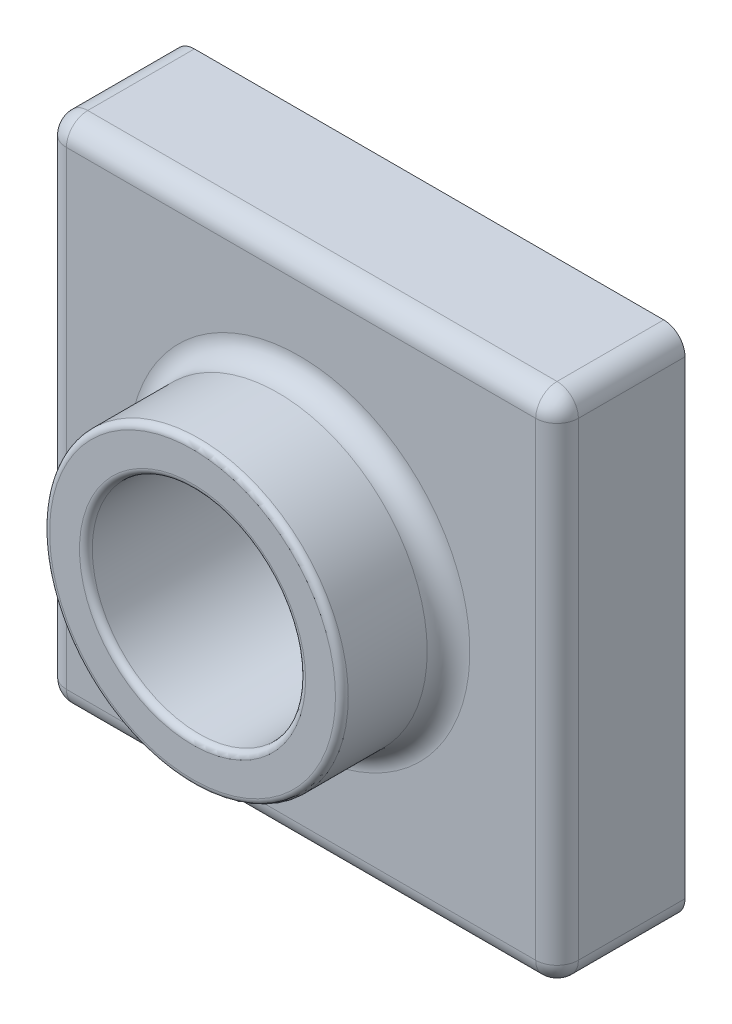
ISO-10303-21;
HEADER;
FILE_DESCRIPTION(('STEP AP214'),'2;1');
FILE_NAME('part.step','',(''),(''),'','','');
FILE_SCHEMA(('AUTOMOTIVE_DESIGN { 1 0 10303 214 1 1 1 1 }'));
ENDSEC;
DATA;
#1=APPLICATION_CONTEXT('core data for automotive mechanical design processes');
#2=APPLICATION_PROTOCOL_DEFINITION('international standard','automotive_design',2000,#1);
#3=PRODUCT_CONTEXT('',#1,'mechanical');
#4=PRODUCT('Part','Part','',(#3));
#5=PRODUCT_RELATED_PRODUCT_CATEGORY('part','',(#4));
#6=PRODUCT_DEFINITION_FORMATION('','',#4);
#7=PRODUCT_DEFINITION_CONTEXT('part definition',#1,'design');
#8=PRODUCT_DEFINITION('design','',#6,#7);
#9=PRODUCT_DEFINITION_SHAPE('','',#8);
#10=(LENGTH_UNIT() NAMED_UNIT(*) SI_UNIT(.MILLI.,.METRE.));
#11=(NAMED_UNIT(*) PLANE_ANGLE_UNIT() SI_UNIT($,.RADIAN.));
#12=(NAMED_UNIT(*) SI_UNIT($,.STERADIAN.) SOLID_ANGLE_UNIT());
#13=UNCERTAINTY_MEASURE_WITH_UNIT(LENGTH_MEASURE(1.E-05),#10,'distance_accuracy_value','');
#14=(GEOMETRIC_REPRESENTATION_CONTEXT(3) GLOBAL_UNCERTAINTY_ASSIGNED_CONTEXT((#13)) GLOBAL_UNIT_ASSIGNED_CONTEXT((#10,
#11,#12)) REPRESENTATION_CONTEXT('',''));
#15=CARTESIAN_POINT('',(0.,0.,0.));
#16=DIRECTION('',(0.,0.,1.));
#17=DIRECTION('',(1.,0.,0.));
#18=AXIS2_PLACEMENT_3D('',#15,#16,#17);
#19=CARTESIAN_POINT('',(0.,0.,0.));
#20=DIRECTION('',(0.,0.,-1.));
#21=DIRECTION('',(-1.,0.,0.));
#22=AXIS2_PLACEMENT_3D('',#19,#20,#21);
#23=PLANE('',#22);
#24=CARTESIAN_POINT('',(59.5646394836595,60.,0.));
#25=DIRECTION('',(0.,0.,-1.));
#26=DIRECTION('',(-1.,0.,0.));
#27=AXIS2_PLACEMENT_3D('',#24,#25,#26);
#28=CIRCLE('',#27,25.);
#29=CARTESIAN_POINT('',(34.5646394836595,60.,0.));
#30=VERTEX_POINT('',#29);
#31=EDGE_CURVE('E297',#30,#30,#28,.T.);
#32=ORIENTED_EDGE('',*,*,#31,.F.);
#33=EDGE_LOOP('',(#32));
#34=FACE_BOUND('',#33,.T.);
#35=CARTESIAN_POINT('',(59.5646394836595,60.,0.));
#36=DIRECTION('',(0.,0.,-1.));
#37=DIRECTION('',(-1.,0.,0.));
#38=AXIS2_PLACEMENT_3D('',#35,#36,#37);
#39=CIRCLE('',#38,27.);
#40=CARTESIAN_POINT('',(32.5646394836595,60.,0.));
#41=VERTEX_POINT('',#40);
#42=EDGE_CURVE('E228',#41,#41,#39,.T.);
#43=ORIENTED_EDGE('',*,*,#42,.T.);
#44=EDGE_LOOP('',(#43));
#45=FACE_BOUND('',#44,.T.);
#46=ADVANCED_FACE('F38',(#34,#45),#23,.T.);
#47=DIRECTION('',(1.,0.,0.));
#48=VECTOR('',#47,1.);
#49=CARTESIAN_POINT('',(0.,0.,0.));
#50=LINE('',#49,#48);
#51=CARTESIAN_POINT('',(5.,0.,0.));
#52=VERTEX_POINT('',#51);
#53=CARTESIAN_POINT('',(115.,0.,0.));
#54=VERTEX_POINT('',#53);
#55=EDGE_CURVE('E303',#52,#54,#50,.T.);
#56=ORIENTED_EDGE('',*,*,#55,.F.);
#57=CARTESIAN_POINT('',(5.,5.,0.));
#58=DIRECTION('',(0.,0.,-1.));
#59=DIRECTION('',(-1.,0.,0.));
#60=AXIS2_PLACEMENT_3D('',#57,#58,#59);
#61=CIRCLE('',#60,5.);
#62=CARTESIAN_POINT('',(0.,5.,0.));
#63=VERTEX_POINT('',#62);
#64=EDGE_CURVE('E357',#52,#63,#61,.T.);
#65=ORIENTED_EDGE('',*,*,#64,.T.);
#66=DIRECTION('',(0.,-1.,0.));
#67=VECTOR('',#66,1.);
#68=CARTESIAN_POINT('',(0.,0.,0.));
#69=LINE('',#68,#67);
#70=CARTESIAN_POINT('',(0.,115.,0.));
#71=VERTEX_POINT('',#70);
#72=EDGE_CURVE('E300',#71,#63,#69,.T.);
#73=ORIENTED_EDGE('',*,*,#72,.F.);
#74=CARTESIAN_POINT('',(4.99999999999996,115.,0.));
#75=DIRECTION('',(0.,0.,-1.));
#76=DIRECTION('',(-1.,0.,0.));
#77=AXIS2_PLACEMENT_3D('',#74,#75,#76);
#78=CIRCLE('',#77,5.);
#79=CARTESIAN_POINT('',(4.99999999999996,120.,0.));
#80=VERTEX_POINT('',#79);
#81=EDGE_CURVE('E353',#71,#80,#78,.T.);
#82=ORIENTED_EDGE('',*,*,#81,.T.);
#83=DIRECTION('',(-1.,0.,0.));
#84=VECTOR('',#83,1.);
#85=CARTESIAN_POINT('',(0.,120.,0.));
#86=LINE('',#85,#84);
#87=CARTESIAN_POINT('',(115.,120.,0.));
#88=VERTEX_POINT('',#87);
#89=EDGE_CURVE('E309',#88,#80,#86,.T.);
#90=ORIENTED_EDGE('',*,*,#89,.F.);
#91=CARTESIAN_POINT('',(115.,115.,0.));
#92=DIRECTION('',(0.,0.,-1.));
#93=DIRECTION('',(-1.,0.,0.));
#94=AXIS2_PLACEMENT_3D('',#91,#92,#93);
#95=CIRCLE('',#94,5.);
#96=CARTESIAN_POINT('',(120.,115.,0.));
#97=VERTEX_POINT('',#96);
#98=EDGE_CURVE('E351',#88,#97,#95,.T.);
#99=ORIENTED_EDGE('',*,*,#98,.T.);
#100=DIRECTION('',(0.,1.,0.));
#101=VECTOR('',#100,1.);
#102=CARTESIAN_POINT('',(120.,0.,0.));
#103=LINE('',#102,#101);
#104=CARTESIAN_POINT('',(120.,5.,0.));
#105=VERTEX_POINT('',#104);
#106=EDGE_CURVE('E306',#105,#97,#103,.T.);
#107=ORIENTED_EDGE('',*,*,#106,.F.);
#108=CARTESIAN_POINT('',(115.,5.,0.));
#109=DIRECTION('',(0.,0.,-1.));
#110=DIRECTION('',(-1.,0.,0.));
#111=AXIS2_PLACEMENT_3D('',#108,#109,#110);
#112=CIRCLE('',#111,5.);
#113=EDGE_CURVE('E355',#105,#54,#112,.T.);
#114=ORIENTED_EDGE('',*,*,#113,.T.);
#115=EDGE_LOOP('',(#56,#65,#73,#82,#90,#99,#107,#114));
#116=FACE_BOUND('',#115,.T.);
#117=CARTESIAN_POINT('',(5.,5.,0.));
#118=DIRECTION('',(0.,0.,-1.));
#119=DIRECTION('',(-1.,0.,0.));
#120=AXIS2_PLACEMENT_3D('',#117,#118,#119);
#121=CIRCLE('',#120,3.);
#122=CARTESIAN_POINT('',(5.,2.,0.));
#123=VERTEX_POINT('',#122);
#124=CARTESIAN_POINT('',(2.,5.,0.));
#125=VERTEX_POINT('',#124);
#126=EDGE_CURVE('E183',#123,#125,#121,.T.);
#127=ORIENTED_EDGE('',*,*,#126,.F.);
#128=DIRECTION('',(1.,0.,0.));
#129=VECTOR('',#128,1.);
#130=CARTESIAN_POINT('',(0.,2.,0.));
#131=LINE('',#130,#129);
#132=CARTESIAN_POINT('',(115.,2.,0.));
#133=VERTEX_POINT('',#132);
#134=EDGE_CURVE('E283',#123,#133,#131,.T.);
#135=ORIENTED_EDGE('',*,*,#134,.T.);
#136=CARTESIAN_POINT('',(115.,5.,0.));
#137=DIRECTION('',(0.,0.,-1.));
#138=DIRECTION('',(-1.,0.,0.));
#139=AXIS2_PLACEMENT_3D('',#136,#137,#138);
#140=CIRCLE('',#139,3.);
#141=CARTESIAN_POINT('',(118.,5.,0.));
#142=VERTEX_POINT('',#141);
#143=EDGE_CURVE('E286',#142,#133,#140,.T.);
#144=ORIENTED_EDGE('',*,*,#143,.F.);
#145=DIRECTION('',(0.,1.,0.));
#146=VECTOR('',#145,1.);
#147=CARTESIAN_POINT('',(118.,0.,0.));
#148=LINE('',#147,#146);
#149=CARTESIAN_POINT('',(118.,115.,0.));
#150=VERTEX_POINT('',#149);
#151=EDGE_CURVE('E53',#142,#150,#148,.T.);
#152=ORIENTED_EDGE('',*,*,#151,.T.);
#153=CARTESIAN_POINT('',(115.,115.,0.));
#154=DIRECTION('',(0.,0.,-1.));
#155=DIRECTION('',(-1.,0.,0.));
#156=AXIS2_PLACEMENT_3D('',#153,#154,#155);
#157=CIRCLE('',#156,3.);
#158=CARTESIAN_POINT('',(115.,118.,0.));
#159=VERTEX_POINT('',#158);
#160=EDGE_CURVE('E273',#159,#150,#157,.T.);
#161=ORIENTED_EDGE('',*,*,#160,.F.);
#162=DIRECTION('',(-1.,0.,0.));
#163=VECTOR('',#162,1.);
#164=CARTESIAN_POINT('',(0.,118.,0.));
#165=LINE('',#164,#163);
#166=CARTESIAN_POINT('',(4.99999999999996,118.,0.));
#167=VERTEX_POINT('',#166);
#168=EDGE_CURVE('E250',#159,#167,#165,.T.);
#169=ORIENTED_EDGE('',*,*,#168,.T.);
#170=CARTESIAN_POINT('',(4.99999999999996,115.,0.));
#171=DIRECTION('',(0.,0.,-1.));
#172=DIRECTION('',(-1.,0.,0.));
#173=AXIS2_PLACEMENT_3D('',#170,#171,#172);
#174=CIRCLE('',#173,3.);
#175=CARTESIAN_POINT('',(1.99999999999996,115.,0.));
#176=VERTEX_POINT('',#175);
#177=EDGE_CURVE('E284',#176,#167,#174,.T.);
#178=ORIENTED_EDGE('',*,*,#177,.F.);
#179=DIRECTION('',(0.,-1.,0.));
#180=VECTOR('',#179,1.);
#181=CARTESIAN_POINT('',(2.,0.,0.));
#182=LINE('',#181,#180);
#183=EDGE_CURVE('E281',#176,#125,#182,.T.);
#184=ORIENTED_EDGE('',*,*,#183,.T.);
#185=EDGE_LOOP('',(#127,#135,#144,#152,#161,#169,#178,#184));
#186=FACE_BOUND('',#185,.T.);
#187=ADVANCED_FACE('F424',(#116,#186),#23,.T.);
#188=CARTESIAN_POINT('',(0.,0.,30.));
#189=DIRECTION('',(1.,0.,0.));
#190=DIRECTION('',(0.,1.,0.));
#191=AXIS2_PLACEMENT_3D('',#188,#189,#190);
#192=PLANE('',#191);
#193=ORIENTED_EDGE('',*,*,#72,.T.);
#194=DIRECTION('',(0.,0.,-1.));
#195=VECTOR('',#194,1.);
#196=CARTESIAN_POINT('',(0.,5.,30.));
#197=LINE('',#196,#195);
#198=CARTESIAN_POINT('',(0.,5.,25.));
#199=VERTEX_POINT('',#198);
#200=EDGE_CURVE('E61',#63,#199,#197,.F.);
#201=ORIENTED_EDGE('',*,*,#200,.T.);
#202=DIRECTION('',(0.,-1.,0.));
#203=VECTOR('',#202,1.);
#204=CARTESIAN_POINT('',(0.,0.,25.));
#205=LINE('',#204,#203);
#206=CARTESIAN_POINT('',(0.,115.,25.));
#207=VERTEX_POINT('',#206);
#208=EDGE_CURVE('E345',#199,#207,#205,.F.);
#209=ORIENTED_EDGE('',*,*,#208,.T.);
#210=DIRECTION('',(0.,0.,-1.));
#211=VECTOR('',#210,1.);
#212=CARTESIAN_POINT('',(0.,115.,30.));
#213=LINE('',#212,#211);
#214=EDGE_CURVE('E343',#207,#71,#213,.T.);
#215=ORIENTED_EDGE('',*,*,#214,.T.);
#216=EDGE_LOOP('',(#193,#201,#209,#215));
#217=FACE_BOUND('',#216,.T.);
#218=ADVANCED_FACE('F430',(#217),#192,.F.);
#219=CARTESIAN_POINT('',(0.,0.,30.));
#220=DIRECTION('',(0.,1.,0.));
#221=DIRECTION('',(0.,0.,1.));
#222=AXIS2_PLACEMENT_3D('',#219,#220,#221);
#223=PLANE('',#222);
#224=DIRECTION('',(1.,0.,0.));
#225=VECTOR('',#224,1.);
#226=CARTESIAN_POINT('',(0.,0.,25.));
#227=LINE('',#226,#225);
#228=CARTESIAN_POINT('',(115.,0.,25.));
#229=VERTEX_POINT('',#228);
#230=CARTESIAN_POINT('',(5.,0.,25.));
#231=VERTEX_POINT('',#230);
#232=EDGE_CURVE('E339',#229,#231,#227,.F.);
#233=ORIENTED_EDGE('',*,*,#232,.T.);
#234=DIRECTION('',(0.,0.,-1.));
#235=VECTOR('',#234,1.);
#236=CARTESIAN_POINT('',(5.,0.,30.));
#237=LINE('',#236,#235);
#238=EDGE_CURVE('E341',#231,#52,#237,.T.);
#239=ORIENTED_EDGE('',*,*,#238,.T.);
#240=ORIENTED_EDGE('',*,*,#55,.T.);
#241=DIRECTION('',(0.,0.,-1.));
#242=VECTOR('',#241,1.);
#243=CARTESIAN_POINT('',(115.,0.,30.));
#244=LINE('',#243,#242);
#245=EDGE_CURVE('E337',#54,#229,#244,.F.);
#246=ORIENTED_EDGE('',*,*,#245,.T.);
#247=EDGE_LOOP('',(#233,#239,#240,#246));
#248=FACE_BOUND('',#247,.T.);
#249=ADVANCED_FACE('F445',(#248),#223,.F.);
#250=CARTESIAN_POINT('',(120.,0.,30.));
#251=DIRECTION('',(-1.,0.,0.));
#252=DIRECTION('',(0.,-1.,0.));
#253=AXIS2_PLACEMENT_3D('',#250,#251,#252);
#254=PLANE('',#253);
#255=DIRECTION('',(0.,1.,0.));
#256=VECTOR('',#255,1.);
#257=CARTESIAN_POINT('',(120.,0.,25.));
#258=LINE('',#257,#256);
#259=CARTESIAN_POINT('',(120.,115.,25.));
#260=VERTEX_POINT('',#259);
#261=CARTESIAN_POINT('',(120.,5.,25.));
#262=VERTEX_POINT('',#261);
#263=EDGE_CURVE('E333',#260,#262,#258,.F.);
#264=ORIENTED_EDGE('',*,*,#263,.T.);
#265=DIRECTION('',(0.,0.,-1.));
#266=VECTOR('',#265,1.);
#267=CARTESIAN_POINT('',(120.,5.,30.));
#268=LINE('',#267,#266);
#269=EDGE_CURVE('E335',#262,#105,#268,.T.);
#270=ORIENTED_EDGE('',*,*,#269,.T.);
#271=ORIENTED_EDGE('',*,*,#106,.T.);
#272=DIRECTION('',(0.,0.,-1.));
#273=VECTOR('',#272,1.);
#274=CARTESIAN_POINT('',(120.,115.,30.));
#275=LINE('',#274,#273);
#276=EDGE_CURVE('E331',#97,#260,#275,.F.);
#277=ORIENTED_EDGE('',*,*,#276,.T.);
#278=EDGE_LOOP('',(#264,#270,#271,#277));
#279=FACE_BOUND('',#278,.T.);
#280=ADVANCED_FACE('F441',(#279),#254,.F.);
#281=CARTESIAN_POINT('',(0.,120.,30.));
#282=DIRECTION('',(0.,-1.,0.));
#283=DIRECTION('',(0.,0.,-1.));
#284=AXIS2_PLACEMENT_3D('',#281,#282,#283);
#285=PLANE('',#284);
#286=ORIENTED_EDGE('',*,*,#89,.T.);
#287=DIRECTION('',(0.,0.,-1.));
#288=VECTOR('',#287,1.);
#289=CARTESIAN_POINT('',(4.99999999999996,120.,30.));
#290=LINE('',#289,#288);
#291=CARTESIAN_POINT('',(4.99999999999996,120.,25.));
#292=VERTEX_POINT('',#291);
#293=EDGE_CURVE('E329',#80,#292,#290,.F.);
#294=ORIENTED_EDGE('',*,*,#293,.T.);
#295=DIRECTION('',(-1.,0.,0.));
#296=VECTOR('',#295,1.);
#297=CARTESIAN_POINT('',(0.,120.,25.));
#298=LINE('',#297,#296);
#299=CARTESIAN_POINT('',(115.,120.,25.));
#300=VERTEX_POINT('',#299);
#301=EDGE_CURVE('E326',#292,#300,#298,.F.);
#302=ORIENTED_EDGE('',*,*,#301,.T.);
#303=DIRECTION('',(0.,0.,-1.));
#304=VECTOR('',#303,1.);
#305=CARTESIAN_POINT('',(115.,120.,30.));
#306=LINE('',#305,#304);
#307=EDGE_CURVE('E324',#300,#88,#306,.T.);
#308=ORIENTED_EDGE('',*,*,#307,.T.);
#309=EDGE_LOOP('',(#286,#294,#302,#308));
#310=FACE_BOUND('',#309,.T.);
#311=ADVANCED_FACE('F438',(#310),#285,.F.);
#312=CARTESIAN_POINT('',(0.,0.,30.));
#313=DIRECTION('',(0.,0.,-1.));
#314=DIRECTION('',(-1.,0.,0.));
#315=AXIS2_PLACEMENT_3D('',#312,#313,#314);
#316=PLANE('',#315);
#317=DIRECTION('',(0.,1.,0.));
#318=VECTOR('',#317,1.);
#319=CARTESIAN_POINT('',(115.,0.,30.));
#320=LINE('',#319,#318);
#321=CARTESIAN_POINT('',(115.,5.,30.));
#322=VERTEX_POINT('',#321);
#323=CARTESIAN_POINT('',(115.,115.,30.));
#324=VERTEX_POINT('',#323);
#325=EDGE_CURVE('E319',#322,#324,#320,.T.);
#326=ORIENTED_EDGE('',*,*,#325,.T.);
#327=DIRECTION('',(-1.,0.,0.));
#328=VECTOR('',#327,1.);
#329=CARTESIAN_POINT('',(0.,115.,30.));
#330=LINE('',#329,#328);
#331=CARTESIAN_POINT('',(4.99999999999996,115.,30.));
#332=VERTEX_POINT('',#331);
#333=EDGE_CURVE('E321',#324,#332,#330,.T.);
#334=ORIENTED_EDGE('',*,*,#333,.T.);
#335=DIRECTION('',(0.,-1.,0.));
#336=VECTOR('',#335,1.);
#337=CARTESIAN_POINT('',(5.,0.,30.));
#338=LINE('',#337,#336);
#339=CARTESIAN_POINT('',(5.,5.,30.));
#340=VERTEX_POINT('',#339);
#341=EDGE_CURVE('E315',#332,#340,#338,.T.);
#342=ORIENTED_EDGE('',*,*,#341,.T.);
#343=DIRECTION('',(1.,0.,0.));
#344=VECTOR('',#343,1.);
#345=CARTESIAN_POINT('',(0.,5.,30.));
#346=LINE('',#345,#344);
#347=EDGE_CURVE('E317',#340,#322,#346,.T.);
#348=ORIENTED_EDGE('',*,*,#347,.T.);
#349=EDGE_LOOP('',(#326,#334,#342,#348));
#350=FACE_BOUND('',#349,.T.);
#351=CARTESIAN_POINT('',(59.5646394836595,60.,30.));
#352=DIRECTION('',(0.,0.,-1.));
#353=DIRECTION('',(-1.,0.,0.));
#354=AXIS2_PLACEMENT_3D('',#351,#352,#353);
#355=CIRCLE('',#354,40.);
#356=CARTESIAN_POINT('',(19.5646394836595,60.,30.));
#357=VERTEX_POINT('',#356);
#358=EDGE_CURVE('E312',#357,#357,#355,.T.);
#359=ORIENTED_EDGE('',*,*,#358,.T.);
#360=EDGE_LOOP('',(#359));
#361=FACE_BOUND('',#360,.T.);
#362=ADVANCED_FACE('F436',(#350,#361),#316,.F.);
#363=CARTESIAN_POINT('',(59.5646394836595,60.,55.));
#364=DIRECTION('',(0.,0.,-1.));
#365=DIRECTION('',(-1.,0.,0.));
#366=AXIS2_PLACEMENT_3D('',#363,#364,#365);
#367=CYLINDRICAL_SURFACE('',#366,35.);
#368=CARTESIAN_POINT('',(59.5646394836595,60.,53.5));
#369=DIRECTION('',(0.,0.,1.));
#370=DIRECTION('',(1.,0.,0.));
#371=AXIS2_PLACEMENT_3D('',#368,#369,#370);
#372=CIRCLE('',#371,35.);
#373=CARTESIAN_POINT('',(94.5646394836595,60.,53.5));
#374=VERTEX_POINT('',#373);
#375=EDGE_CURVE('E46',#374,#374,#372,.F.);
#376=ORIENTED_EDGE('',*,*,#375,.T.);
#377=EDGE_LOOP('',(#376));
#378=FACE_BOUND('',#377,.T.);
#379=CARTESIAN_POINT('',(59.5646394836595,60.,35.));
#380=DIRECTION('',(0.,0.,-1.));
#381=DIRECTION('',(-1.,0.,0.));
#382=AXIS2_PLACEMENT_3D('',#379,#380,#381);
#383=CIRCLE('',#382,35.);
#384=CARTESIAN_POINT('',(24.5646394836595,60.,35.));
#385=VERTEX_POINT('',#384);
#386=EDGE_CURVE('E348',#385,#385,#383,.F.);
#387=ORIENTED_EDGE('',*,*,#386,.T.);
#388=EDGE_LOOP('',(#387));
#389=FACE_BOUND('',#388,.T.);
#390=ADVANCED_FACE('F399',(#378,#389),#367,.T.);
#391=CARTESIAN_POINT('',(59.5646394836595,60.,55.));
#392=DIRECTION('',(0.,0.,1.));
#393=DIRECTION('',(1.,0.,0.));
#394=AXIS2_PLACEMENT_3D('',#391,#392,#393);
#395=PLANE('',#394);
#396=CARTESIAN_POINT('',(59.5646394836595,60.,55.));
#397=DIRECTION('',(0.,0.,1.));
#398=DIRECTION('',(1.,0.,0.));
#399=AXIS2_PLACEMENT_3D('',#396,#397,#398);
#400=CIRCLE('',#399,33.5);
#401=CARTESIAN_POINT('',(93.0646394836595,60.,55.));
#402=VERTEX_POINT('',#401);
#403=EDGE_CURVE('E394',#402,#402,#400,.T.);
#404=ORIENTED_EDGE('',*,*,#403,.T.);
#405=EDGE_LOOP('',(#404));
#406=FACE_BOUND('',#405,.T.);
#407=CARTESIAN_POINT('',(59.5646394836595,60.,55.));
#408=DIRECTION('',(0.,0.,1.));
#409=DIRECTION('',(1.,0.,0.));
#410=AXIS2_PLACEMENT_3D('',#407,#408,#409);
#411=CIRCLE('',#410,26.5);
#412=CARTESIAN_POINT('',(86.0646394836595,60.,55.));
#413=VERTEX_POINT('',#412);
#414=EDGE_CURVE('E359',#413,#413,#411,.F.);
#415=ORIENTED_EDGE('',*,*,#414,.T.);
#416=EDGE_LOOP('',(#415));
#417=FACE_BOUND('',#416,.T.);
#418=ADVANCED_FACE('F408',(#406,#417),#395,.T.);
#419=CARTESIAN_POINT('',(59.5646394836595,60.,55.));
#420=DIRECTION('',(0.,0.,-1.));
#421=DIRECTION('',(-1.,0.,0.));
#422=AXIS2_PLACEMENT_3D('',#419,#420,#421);
#423=CYLINDRICAL_SURFACE('',#422,25.);
#424=CARTESIAN_POINT('',(59.5646394836595,60.,53.5));
#425=DIRECTION('',(0.,0.,1.));
#426=DIRECTION('',(1.,0.,0.));
#427=AXIS2_PLACEMENT_3D('',#424,#425,#426);
#428=CIRCLE('',#427,25.);
#429=CARTESIAN_POINT('',(84.5646394836595,60.,53.5));
#430=VERTEX_POINT('',#429);
#431=EDGE_CURVE('E11',#430,#430,#428,.T.);
#432=ORIENTED_EDGE('',*,*,#431,.T.);
#433=EDGE_LOOP('',(#432));
#434=FACE_BOUND('',#433,.T.);
#435=ORIENTED_EDGE('',*,*,#31,.T.);
#436=EDGE_LOOP('',(#435));
#437=FACE_BOUND('',#436,.T.);
#438=ADVANCED_FACE('F411',(#434,#437),#423,.F.);
#439=CARTESIAN_POINT('',(115.,5.,30.));
#440=DIRECTION('',(0.,0.,-1.));
#441=DIRECTION('',(-1.,0.,0.));
#442=AXIS2_PLACEMENT_3D('',#439,#440,#441);
#443=CYLINDRICAL_SURFACE('',#442,5.);
#444=ORIENTED_EDGE('',*,*,#113,.F.);
#445=ORIENTED_EDGE('',*,*,#269,.F.);
#446=CARTESIAN_POINT('',(115.,5.,25.));
#447=DIRECTION('',(0.,0.,1.));
#448=DIRECTION('',(1.,0.,0.));
#449=AXIS2_PLACEMENT_3D('',#446,#447,#448);
#450=CIRCLE('',#449,5.);
#451=EDGE_CURVE('E301',#229,#262,#450,.T.);
#452=ORIENTED_EDGE('',*,*,#451,.F.);
#453=ORIENTED_EDGE('',*,*,#245,.F.);
#454=EDGE_LOOP('',(#444,#445,#452,#453));
#455=FACE_BOUND('',#454,.T.);
#456=ADVANCED_FACE('F495',(#455),#443,.T.);
#457=CARTESIAN_POINT('',(0.,5.,25.));
#458=DIRECTION('',(1.,0.,0.));
#459=DIRECTION('',(0.,0.,-1.));
#460=AXIS2_PLACEMENT_3D('',#457,#458,#459);
#461=CYLINDRICAL_SURFACE('',#460,5.);
#462=CARTESIAN_POINT('',(5.,5.,25.));
#463=DIRECTION('',(-1.,0.,0.));
#464=DIRECTION('',(0.,0.,1.));
#465=AXIS2_PLACEMENT_3D('',#462,#463,#464);
#466=CIRCLE('',#465,5.);
#467=EDGE_CURVE('E384',#231,#340,#466,.T.);
#468=ORIENTED_EDGE('',*,*,#467,.F.);
#469=ORIENTED_EDGE('',*,*,#232,.F.);
#470=CARTESIAN_POINT('',(115.,5.,25.));
#471=DIRECTION('',(1.,0.,0.));
#472=DIRECTION('',(0.,0.,-1.));
#473=AXIS2_PLACEMENT_3D('',#470,#471,#472);
#474=CIRCLE('',#473,5.);
#475=EDGE_CURVE('E387',#322,#229,#474,.T.);
#476=ORIENTED_EDGE('',*,*,#475,.F.);
#477=ORIENTED_EDGE('',*,*,#347,.F.);
#478=EDGE_LOOP('',(#468,#469,#476,#477));
#479=FACE_BOUND('',#478,.T.);
#480=ADVANCED_FACE('F491',(#479),#461,.T.);
#481=CARTESIAN_POINT('',(5.,5.,30.));
#482=DIRECTION('',(0.,0.,-1.));
#483=DIRECTION('',(-1.,0.,0.));
#484=AXIS2_PLACEMENT_3D('',#481,#482,#483);
#485=CYLINDRICAL_SURFACE('',#484,5.);
#486=ORIENTED_EDGE('',*,*,#64,.F.);
#487=ORIENTED_EDGE('',*,*,#238,.F.);
#488=CARTESIAN_POINT('',(5.,5.,25.));
#489=DIRECTION('',(0.,0.,1.));
#490=DIRECTION('',(1.,0.,0.));
#491=AXIS2_PLACEMENT_3D('',#488,#489,#490);
#492=CIRCLE('',#491,5.);
#493=EDGE_CURVE('E381',#199,#231,#492,.T.);
#494=ORIENTED_EDGE('',*,*,#493,.F.);
#495=ORIENTED_EDGE('',*,*,#200,.F.);
#496=EDGE_LOOP('',(#486,#487,#494,#495));
#497=FACE_BOUND('',#496,.T.);
#498=ADVANCED_FACE('F487',(#497),#485,.T.);
#499=CARTESIAN_POINT('',(115.,5.,25.));
#500=DIRECTION('',(0.,-1.,0.));
#501=DIRECTION('',(0.,0.,-1.));
#502=AXIS2_PLACEMENT_3D('',#499,#500,#501);
#503=SPHERICAL_SURFACE('',#502,5.);
#504=ORIENTED_EDGE('',*,*,#475,.T.);
#505=ORIENTED_EDGE('',*,*,#451,.T.);
#506=CARTESIAN_POINT('',(115.,5.,25.));
#507=DIRECTION('',(0.,-1.,0.));
#508=DIRECTION('',(1.,0.,0.));
#509=AXIS2_PLACEMENT_3D('',#506,#507,#508);
#510=CIRCLE('',#509,5.);
#511=EDGE_CURVE('E378',#322,#262,#510,.F.);
#512=ORIENTED_EDGE('',*,*,#511,.F.);
#513=EDGE_LOOP('',(#504,#505,#512));
#514=FACE_BOUND('',#513,.T.);
#515=ADVANCED_FACE('F483',(#514),#503,.T.);
#516=CARTESIAN_POINT('',(5.,5.,25.));
#517=DIRECTION('',(0.,-1.,0.));
#518=DIRECTION('',(0.,0.,-1.));
#519=AXIS2_PLACEMENT_3D('',#516,#517,#518);
#520=SPHERICAL_SURFACE('',#519,5.);
#521=ORIENTED_EDGE('',*,*,#493,.T.);
#522=ORIENTED_EDGE('',*,*,#467,.T.);
#523=CARTESIAN_POINT('',(5.,5.,25.));
#524=DIRECTION('',(0.,-1.,0.));
#525=DIRECTION('',(1.,0.,0.));
#526=AXIS2_PLACEMENT_3D('',#523,#524,#525);
#527=CIRCLE('',#526,5.);
#528=EDGE_CURVE('E375',#199,#340,#527,.F.);
#529=ORIENTED_EDGE('',*,*,#528,.F.);
#530=EDGE_LOOP('',(#521,#522,#529));
#531=FACE_BOUND('',#530,.T.);
#532=ADVANCED_FACE('F479',(#531),#520,.T.);
#533=CARTESIAN_POINT('',(115.,115.,30.));
#534=DIRECTION('',(0.,0.,-1.));
#535=DIRECTION('',(-1.,0.,0.));
#536=AXIS2_PLACEMENT_3D('',#533,#534,#535);
#537=CYLINDRICAL_SURFACE('',#536,5.);
#538=ORIENTED_EDGE('',*,*,#98,.F.);
#539=ORIENTED_EDGE('',*,*,#307,.F.);
#540=CARTESIAN_POINT('',(115.,115.,25.));
#541=DIRECTION('',(0.,0.,1.));
#542=DIRECTION('',(1.,0.,0.));
#543=AXIS2_PLACEMENT_3D('',#540,#541,#542);
#544=CIRCLE('',#543,5.);
#545=EDGE_CURVE('E372',#260,#300,#544,.T.);
#546=ORIENTED_EDGE('',*,*,#545,.F.);
#547=ORIENTED_EDGE('',*,*,#276,.F.);
#548=EDGE_LOOP('',(#538,#539,#546,#547));
#549=FACE_BOUND('',#548,.T.);
#550=ADVANCED_FACE('F475',(#549),#537,.T.);
#551=CARTESIAN_POINT('',(115.,0.,25.));
#552=DIRECTION('',(0.,1.,0.));
#553=DIRECTION('',(-1.,0.,0.));
#554=AXIS2_PLACEMENT_3D('',#551,#552,#553);
#555=CYLINDRICAL_SURFACE('',#554,5.);
#556=ORIENTED_EDGE('',*,*,#511,.T.);
#557=ORIENTED_EDGE('',*,*,#263,.F.);
#558=CARTESIAN_POINT('',(115.,115.,25.));
#559=DIRECTION('',(0.,1.,0.));
#560=DIRECTION('',(0.,0.,1.));
#561=AXIS2_PLACEMENT_3D('',#558,#559,#560);
#562=CIRCLE('',#561,5.);
#563=EDGE_CURVE('E369',#324,#260,#562,.T.);
#564=ORIENTED_EDGE('',*,*,#563,.F.);
#565=ORIENTED_EDGE('',*,*,#325,.F.);
#566=EDGE_LOOP('',(#556,#557,#564,#565));
#567=FACE_BOUND('',#566,.T.);
#568=ADVANCED_FACE('F471',(#567),#555,.T.);
#569=CARTESIAN_POINT('',(5.,0.,25.));
#570=DIRECTION('',(0.,-1.,0.));
#571=DIRECTION('',(1.,0.,0.));
#572=AXIS2_PLACEMENT_3D('',#569,#570,#571);
#573=CYLINDRICAL_SURFACE('',#572,5.);
#574=ORIENTED_EDGE('',*,*,#528,.T.);
#575=ORIENTED_EDGE('',*,*,#341,.F.);
#576=CARTESIAN_POINT('',(4.99999999999996,115.,25.));
#577=DIRECTION('',(0.,1.,0.));
#578=DIRECTION('',(0.,0.,1.));
#579=AXIS2_PLACEMENT_3D('',#576,#577,#578);
#580=CIRCLE('',#579,5.);
#581=EDGE_CURVE('E366',#207,#332,#580,.T.);
#582=ORIENTED_EDGE('',*,*,#581,.F.);
#583=ORIENTED_EDGE('',*,*,#208,.F.);
#584=EDGE_LOOP('',(#574,#575,#582,#583));
#585=FACE_BOUND('',#584,.T.);
#586=ADVANCED_FACE('F467',(#585),#573,.T.);
#587=CARTESIAN_POINT('',(4.99999999999996,115.,30.));
#588=DIRECTION('',(0.,0.,-1.));
#589=DIRECTION('',(-1.,0.,0.));
#590=AXIS2_PLACEMENT_3D('',#587,#588,#589);
#591=CYLINDRICAL_SURFACE('',#590,5.);
#592=ORIENTED_EDGE('',*,*,#81,.F.);
#593=ORIENTED_EDGE('',*,*,#214,.F.);
#594=CARTESIAN_POINT('',(4.99999999999996,115.,25.));
#595=DIRECTION('',(0.,0.,1.));
#596=DIRECTION('',(1.,0.,0.));
#597=AXIS2_PLACEMENT_3D('',#594,#595,#596);
#598=CIRCLE('',#597,5.);
#599=EDGE_CURVE('E363',#292,#207,#598,.T.);
#600=ORIENTED_EDGE('',*,*,#599,.F.);
#601=ORIENTED_EDGE('',*,*,#293,.F.);
#602=EDGE_LOOP('',(#592,#593,#600,#601));
#603=FACE_BOUND('',#602,.T.);
#604=ADVANCED_FACE('F463',(#603),#591,.T.);
#605=CARTESIAN_POINT('',(115.,115.,25.));
#606=DIRECTION('',(1.,0.,0.));
#607=DIRECTION('',(0.,0.,-1.));
#608=AXIS2_PLACEMENT_3D('',#605,#606,#607);
#609=SPHERICAL_SURFACE('',#608,5.);
#610=ORIENTED_EDGE('',*,*,#563,.T.);
#611=ORIENTED_EDGE('',*,*,#545,.T.);
#612=CARTESIAN_POINT('',(115.,115.,25.));
#613=DIRECTION('',(1.,0.,0.));
#614=DIRECTION('',(0.,0.,-1.));
#615=AXIS2_PLACEMENT_3D('',#612,#613,#614);
#616=CIRCLE('',#615,5.);
#617=EDGE_CURVE('E361',#324,#300,#616,.F.);
#618=ORIENTED_EDGE('',*,*,#617,.F.);
#619=EDGE_LOOP('',(#610,#611,#618));
#620=FACE_BOUND('',#619,.T.);
#621=ADVANCED_FACE('F459',(#620),#609,.T.);
#622=CARTESIAN_POINT('',(4.99999999999996,115.,25.));
#623=DIRECTION('',(-1.,0.,0.));
#624=DIRECTION('',(0.,0.,1.));
#625=AXIS2_PLACEMENT_3D('',#622,#623,#624);
#626=SPHERICAL_SURFACE('',#625,5.);
#627=ORIENTED_EDGE('',*,*,#599,.T.);
#628=ORIENTED_EDGE('',*,*,#581,.T.);
#629=CARTESIAN_POINT('',(4.99999999999996,115.,25.));
#630=DIRECTION('',(-1.,0.,0.));
#631=DIRECTION('',(0.,0.,1.));
#632=AXIS2_PLACEMENT_3D('',#629,#630,#631);
#633=CIRCLE('',#632,5.);
#634=EDGE_CURVE('E277',#292,#332,#633,.F.);
#635=ORIENTED_EDGE('',*,*,#634,.F.);
#636=EDGE_LOOP('',(#627,#628,#635));
#637=FACE_BOUND('',#636,.T.);
#638=ADVANCED_FACE('F455',(#637),#626,.T.);
#639=CARTESIAN_POINT('',(0.,115.,25.));
#640=DIRECTION('',(-1.,0.,0.));
#641=DIRECTION('',(0.,0.,1.));
#642=AXIS2_PLACEMENT_3D('',#639,#640,#641);
#643=CYLINDRICAL_SURFACE('',#642,5.);
#644=ORIENTED_EDGE('',*,*,#617,.T.);
#645=ORIENTED_EDGE('',*,*,#301,.F.);
#646=ORIENTED_EDGE('',*,*,#634,.T.);
#647=ORIENTED_EDGE('',*,*,#333,.F.);
#648=EDGE_LOOP('',(#644,#645,#646,#647));
#649=FACE_BOUND('',#648,.T.);
#650=ADVANCED_FACE('F452',(#649),#643,.T.);
#651=CARTESIAN_POINT('',(59.5646394836595,60.,35.));
#652=DIRECTION('',(0.,0.,-1.));
#653=DIRECTION('',(-1.,0.,0.));
#654=AXIS2_PLACEMENT_3D('',#651,#652,#653);
#655=TOROIDAL_SURFACE('',#654,40.,5.);
#656=ORIENTED_EDGE('',*,*,#358,.F.);
#657=EDGE_LOOP('',(#656));
#658=FACE_BOUND('',#657,.T.);
#659=ORIENTED_EDGE('',*,*,#386,.F.);
#660=EDGE_LOOP('',(#659));
#661=FACE_BOUND('',#660,.T.);
#662=ADVANCED_FACE('F405',(#658,#661),#655,.F.);
#663=CARTESIAN_POINT('',(59.5646394836595,60.,53.5));
#664=DIRECTION('',(0.,0.,1.));
#665=DIRECTION('',(1.,0.,0.));
#666=AXIS2_PLACEMENT_3D('',#663,#664,#665);
#667=TOROIDAL_SURFACE('',#666,33.5,1.5);
#668=ORIENTED_EDGE('',*,*,#375,.F.);
#669=EDGE_LOOP('',(#668));
#670=FACE_BOUND('',#669,.T.);
#671=ORIENTED_EDGE('',*,*,#403,.F.);
#672=EDGE_LOOP('',(#671));
#673=FACE_BOUND('',#672,.T.);
#674=ADVANCED_FACE('F402',(#670,#673),#667,.T.);
#675=CARTESIAN_POINT('',(59.5646394836595,60.,53.5));
#676=DIRECTION('',(0.,0.,1.));
#677=DIRECTION('',(1.,0.,0.));
#678=AXIS2_PLACEMENT_3D('',#675,#676,#677);
#679=TOROIDAL_SURFACE('',#678,26.5,1.5);
#680=ORIENTED_EDGE('',*,*,#431,.F.);
#681=EDGE_LOOP('',(#680));
#682=FACE_BOUND('',#681,.T.);
#683=ORIENTED_EDGE('',*,*,#414,.F.);
#684=EDGE_LOOP('',(#683));
#685=FACE_BOUND('',#684,.T.);
#686=ADVANCED_FACE('F40',(#682,#685),#679,.T.);
#687=CARTESIAN_POINT('',(2.,0.,30.));
#688=DIRECTION('',(1.,0.,0.));
#689=DIRECTION('',(0.,1.,0.));
#690=AXIS2_PLACEMENT_3D('',#687,#688,#689);
#691=PLANE('',#690);
#692=ORIENTED_EDGE('',*,*,#183,.F.);
#693=DIRECTION('',(0.,0.,1.));
#694=VECTOR('',#693,1.);
#695=CARTESIAN_POINT('',(1.99999999999996,115.,30.));
#696=LINE('',#695,#694);
#697=CARTESIAN_POINT('',(1.99999999999996,115.,25.));
#698=VERTEX_POINT('',#697);
#699=EDGE_CURVE('E211',#698,#176,#696,.F.);
#700=ORIENTED_EDGE('',*,*,#699,.F.);
#701=DIRECTION('',(0.,1.,0.));
#702=VECTOR('',#701,1.);
#703=CARTESIAN_POINT('',(2.,0.,25.));
#704=LINE('',#703,#702);
#705=CARTESIAN_POINT('',(2.,5.,25.));
#706=VERTEX_POINT('',#705);
#707=EDGE_CURVE('E189',#706,#698,#704,.T.);
#708=ORIENTED_EDGE('',*,*,#707,.F.);
#709=DIRECTION('',(0.,0.,1.));
#710=VECTOR('',#709,1.);
#711=CARTESIAN_POINT('',(2.,5.,30.));
#712=LINE('',#711,#710);
#713=EDGE_CURVE('E178',#125,#706,#712,.T.);
#714=ORIENTED_EDGE('',*,*,#713,.F.);
#715=EDGE_LOOP('',(#692,#700,#708,#714));
#716=FACE_BOUND('',#715,.T.);
#717=ADVANCED_FACE('F210',(#716),#691,.T.);
#718=CARTESIAN_POINT('',(0.,2.,30.));
#719=DIRECTION('',(0.,1.,0.));
#720=DIRECTION('',(0.,0.,1.));
#721=AXIS2_PLACEMENT_3D('',#718,#719,#720);
#722=PLANE('',#721);
#723=DIRECTION('',(1.,0.,0.));
#724=VECTOR('',#723,1.);
#725=CARTESIAN_POINT('',(0.,2.,25.));
#726=LINE('',#725,#724);
#727=CARTESIAN_POINT('',(115.,2.,25.));
#728=VERTEX_POINT('',#727);
#729=CARTESIAN_POINT('',(5.,2.,25.));
#730=VERTEX_POINT('',#729);
#731=EDGE_CURVE('E217',#728,#730,#726,.F.);
#732=ORIENTED_EDGE('',*,*,#731,.F.);
#733=DIRECTION('',(0.,0.,1.));
#734=VECTOR('',#733,1.);
#735=CARTESIAN_POINT('',(115.,2.,30.));
#736=LINE('',#735,#734);
#737=EDGE_CURVE('E220',#133,#728,#736,.T.);
#738=ORIENTED_EDGE('',*,*,#737,.F.);
#739=ORIENTED_EDGE('',*,*,#134,.F.);
#740=DIRECTION('',(0.,0.,1.));
#741=VECTOR('',#740,1.);
#742=CARTESIAN_POINT('',(5.,2.,30.));
#743=LINE('',#742,#741);
#744=EDGE_CURVE('E214',#730,#123,#743,.F.);
#745=ORIENTED_EDGE('',*,*,#744,.F.);
#746=EDGE_LOOP('',(#732,#738,#739,#745));
#747=FACE_BOUND('',#746,.T.);
#748=ADVANCED_FACE('F420',(#747),#722,.T.);
#749=CARTESIAN_POINT('',(118.,0.,30.));
#750=DIRECTION('',(-1.,0.,0.));
#751=DIRECTION('',(0.,-1.,0.));
#752=AXIS2_PLACEMENT_3D('',#749,#750,#751);
#753=PLANE('',#752);
#754=DIRECTION('',(0.,-1.,0.));
#755=VECTOR('',#754,1.);
#756=CARTESIAN_POINT('',(118.,0.,25.));
#757=LINE('',#756,#755);
#758=CARTESIAN_POINT('',(118.,115.,25.));
#759=VERTEX_POINT('',#758);
#760=CARTESIAN_POINT('',(118.,5.,25.));
#761=VERTEX_POINT('',#760);
#762=EDGE_CURVE('E224',#759,#761,#757,.T.);
#763=ORIENTED_EDGE('',*,*,#762,.F.);
#764=DIRECTION('',(0.,0.,1.));
#765=VECTOR('',#764,1.);
#766=CARTESIAN_POINT('',(118.,115.,30.));
#767=LINE('',#766,#765);
#768=EDGE_CURVE('E231',#150,#759,#767,.T.);
#769=ORIENTED_EDGE('',*,*,#768,.F.);
#770=ORIENTED_EDGE('',*,*,#151,.F.);
#771=DIRECTION('',(0.,0.,1.));
#772=VECTOR('',#771,1.);
#773=CARTESIAN_POINT('',(118.,5.,30.));
#774=LINE('',#773,#772);
#775=EDGE_CURVE('E222',#761,#142,#774,.F.);
#776=ORIENTED_EDGE('',*,*,#775,.F.);
#777=EDGE_LOOP('',(#763,#769,#770,#776));
#778=FACE_BOUND('',#777,.T.);
#779=ADVANCED_FACE('F581',(#778),#753,.T.);
#780=CARTESIAN_POINT('',(0.,118.,30.));
#781=DIRECTION('',(0.,-1.,0.));
#782=DIRECTION('',(0.,0.,-1.));
#783=AXIS2_PLACEMENT_3D('',#780,#781,#782);
#784=PLANE('',#783);
#785=ORIENTED_EDGE('',*,*,#168,.F.);
#786=DIRECTION('',(0.,0.,-1.));
#787=VECTOR('',#786,1.);
#788=CARTESIAN_POINT('',(115.,118.,30.));
#789=LINE('',#788,#787);
#790=CARTESIAN_POINT('',(115.,118.,25.));
#791=VERTEX_POINT('',#790);
#792=EDGE_CURVE('E244',#791,#159,#789,.T.);
#793=ORIENTED_EDGE('',*,*,#792,.F.);
#794=DIRECTION('',(1.,0.,0.));
#795=VECTOR('',#794,1.);
#796=CARTESIAN_POINT('',(0.,118.,25.));
#797=LINE('',#796,#795);
#798=CARTESIAN_POINT('',(4.99999999999996,118.,25.));
#799=VERTEX_POINT('',#798);
#800=EDGE_CURVE('E260',#799,#791,#797,.T.);
#801=ORIENTED_EDGE('',*,*,#800,.F.);
#802=DIRECTION('',(0.,0.,-1.));
#803=VECTOR('',#802,1.);
#804=CARTESIAN_POINT('',(4.99999999999996,118.,30.));
#805=LINE('',#804,#803);
#806=EDGE_CURVE('E233',#167,#799,#805,.F.);
#807=ORIENTED_EDGE('',*,*,#806,.F.);
#808=EDGE_LOOP('',(#785,#793,#801,#807));
#809=FACE_BOUND('',#808,.T.);
#810=ADVANCED_FACE('F577',(#809),#784,.T.);
#811=CARTESIAN_POINT('',(0.,0.,28.));
#812=DIRECTION('',(0.,0.,-1.));
#813=DIRECTION('',(-1.,0.,0.));
#814=AXIS2_PLACEMENT_3D('',#811,#812,#813);
#815=PLANE('',#814);
#816=DIRECTION('',(0.,1.,0.));
#817=VECTOR('',#816,1.);
#818=CARTESIAN_POINT('',(115.,0.,28.));
#819=LINE('',#818,#817);
#820=CARTESIAN_POINT('',(115.,5.,28.));
#821=VERTEX_POINT('',#820);
#822=CARTESIAN_POINT('',(115.,115.,28.));
#823=VERTEX_POINT('',#822);
#824=EDGE_CURVE('E238',#821,#823,#819,.T.);
#825=ORIENTED_EDGE('',*,*,#824,.F.);
#826=DIRECTION('',(-1.,0.,0.));
#827=VECTOR('',#826,1.);
#828=CARTESIAN_POINT('',(0.,5.,28.));
#829=LINE('',#828,#827);
#830=CARTESIAN_POINT('',(5.,5.,28.));
#831=VERTEX_POINT('',#830);
#832=EDGE_CURVE('E241',#831,#821,#829,.F.);
#833=ORIENTED_EDGE('',*,*,#832,.F.);
#834=DIRECTION('',(0.,1.,0.));
#835=VECTOR('',#834,1.);
#836=CARTESIAN_POINT('',(4.99999999999996,0.,28.));
#837=LINE('',#836,#835);
#838=CARTESIAN_POINT('',(4.99999999999996,115.,28.));
#839=VERTEX_POINT('',#838);
#840=EDGE_CURVE('E206',#839,#831,#837,.F.);
#841=ORIENTED_EDGE('',*,*,#840,.F.);
#842=DIRECTION('',(-1.,0.,0.));
#843=VECTOR('',#842,1.);
#844=CARTESIAN_POINT('',(0.,115.,28.));
#845=LINE('',#844,#843);
#846=EDGE_CURVE('E240',#823,#839,#845,.T.);
#847=ORIENTED_EDGE('',*,*,#846,.F.);
#848=EDGE_LOOP('',(#825,#833,#841,#847));
#849=FACE_BOUND('',#848,.T.);
#850=CARTESIAN_POINT('',(59.5646394836595,60.,28.));
#851=DIRECTION('',(0.,0.,-1.));
#852=DIRECTION('',(-1.,0.,0.));
#853=AXIS2_PLACEMENT_3D('',#850,#851,#852);
#854=CIRCLE('',#853,40.);
#855=CARTESIAN_POINT('',(19.5646394836595,60.,28.));
#856=VERTEX_POINT('',#855);
#857=EDGE_CURVE('E246',#856,#856,#854,.T.);
#858=ORIENTED_EDGE('',*,*,#857,.F.);
#859=EDGE_LOOP('',(#858));
#860=FACE_BOUND('',#859,.T.);
#861=ADVANCED_FACE('F573',(#849,#860),#815,.T.);
#862=CARTESIAN_POINT('',(59.5646394836595,60.,55.));
#863=DIRECTION('',(0.,0.,-1.));
#864=DIRECTION('',(-1.,0.,0.));
#865=AXIS2_PLACEMENT_3D('',#862,#863,#864);
#866=CYLINDRICAL_SURFACE('',#865,33.);
#867=CARTESIAN_POINT('',(59.5646394836595,60.,53.));
#868=DIRECTION('',(0.,0.,1.));
#869=DIRECTION('',(1.,0.,0.));
#870=AXIS2_PLACEMENT_3D('',#867,#868,#869);
#871=CIRCLE('',#870,33.);
#872=CARTESIAN_POINT('',(92.5646394836595,60.,53.));
#873=VERTEX_POINT('',#872);
#874=EDGE_CURVE('E274',#873,#873,#871,.T.);
#875=ORIENTED_EDGE('',*,*,#874,.T.);
#876=EDGE_LOOP('',(#875));
#877=FACE_BOUND('',#876,.T.);
#878=CARTESIAN_POINT('',(59.5646394836595,60.,35.));
#879=DIRECTION('',(0.,0.,-1.));
#880=DIRECTION('',(-1.,0.,0.));
#881=AXIS2_PLACEMENT_3D('',#878,#879,#880);
#882=CIRCLE('',#881,33.);
#883=CARTESIAN_POINT('',(26.5646394836595,60.,35.));
#884=VERTEX_POINT('',#883);
#885=EDGE_CURVE('E188',#884,#884,#882,.F.);
#886=ORIENTED_EDGE('',*,*,#885,.F.);
#887=EDGE_LOOP('',(#886));
#888=FACE_BOUND('',#887,.T.);
#889=ADVANCED_FACE('F569',(#877,#888),#866,.F.);
#890=CARTESIAN_POINT('',(59.5646394836595,60.,53.));
#891=DIRECTION('',(0.,0.,1.));
#892=DIRECTION('',(1.,0.,0.));
#893=AXIS2_PLACEMENT_3D('',#890,#891,#892);
#894=PLANE('',#893);
#895=ORIENTED_EDGE('',*,*,#874,.F.);
#896=EDGE_LOOP('',(#895));
#897=FACE_BOUND('',#896,.T.);
#898=CARTESIAN_POINT('',(59.5646394836595,60.,53.));
#899=DIRECTION('',(0.,0.,1.));
#900=DIRECTION('',(1.,0.,0.));
#901=AXIS2_PLACEMENT_3D('',#898,#899,#900);
#902=CIRCLE('',#901,27.);
#903=CARTESIAN_POINT('',(86.5646394836595,60.,53.));
#904=VERTEX_POINT('',#903);
#905=EDGE_CURVE('E278',#904,#904,#902,.F.);
#906=ORIENTED_EDGE('',*,*,#905,.F.);
#907=EDGE_LOOP('',(#906));
#908=FACE_BOUND('',#907,.T.);
#909=ADVANCED_FACE('F565',(#897,#908),#894,.F.);
#910=CARTESIAN_POINT('',(59.5646394836595,60.,55.));
#911=DIRECTION('',(0.,0.,-1.));
#912=DIRECTION('',(-1.,0.,0.));
#913=AXIS2_PLACEMENT_3D('',#910,#911,#912);
#914=CYLINDRICAL_SURFACE('',#913,27.);
#915=ORIENTED_EDGE('',*,*,#905,.T.);
#916=EDGE_LOOP('',(#915));
#917=FACE_BOUND('',#916,.T.);
#918=ORIENTED_EDGE('',*,*,#42,.F.);
#919=EDGE_LOOP('',(#918));
#920=FACE_BOUND('',#919,.T.);
#921=ADVANCED_FACE('F561',(#917,#920),#914,.T.);
#922=CARTESIAN_POINT('',(115.,5.,30.));
#923=DIRECTION('',(0.,0.,-1.));
#924=DIRECTION('',(-1.,0.,0.));
#925=AXIS2_PLACEMENT_3D('',#922,#923,#924);
#926=CYLINDRICAL_SURFACE('',#925,3.);
#927=ORIENTED_EDGE('',*,*,#143,.T.);
#928=ORIENTED_EDGE('',*,*,#737,.T.);
#929=CARTESIAN_POINT('',(115.,5.,25.));
#930=DIRECTION('',(0.,0.,-1.));
#931=DIRECTION('',(-1.,0.,0.));
#932=AXIS2_PLACEMENT_3D('',#929,#930,#931);
#933=CIRCLE('',#932,3.);
#934=EDGE_CURVE('E225',#728,#761,#933,.F.);
#935=ORIENTED_EDGE('',*,*,#934,.T.);
#936=ORIENTED_EDGE('',*,*,#775,.T.);
#937=EDGE_LOOP('',(#927,#928,#935,#936));
#938=FACE_BOUND('',#937,.T.);
#939=ADVANCED_FACE('F557',(#938),#926,.F.);
#940=CARTESIAN_POINT('',(0.,5.,25.));
#941=DIRECTION('',(1.,0.,0.));
#942=DIRECTION('',(0.,0.,-1.));
#943=AXIS2_PLACEMENT_3D('',#940,#941,#942);
#944=CYLINDRICAL_SURFACE('',#943,3.);
#945=CARTESIAN_POINT('',(5.,5.,25.));
#946=DIRECTION('',(1.,0.,0.));
#947=DIRECTION('',(0.,0.,-1.));
#948=AXIS2_PLACEMENT_3D('',#945,#946,#947);
#949=CIRCLE('',#948,3.);
#950=EDGE_CURVE('E198',#730,#831,#949,.F.);
#951=ORIENTED_EDGE('',*,*,#950,.T.);
#952=ORIENTED_EDGE('',*,*,#832,.T.);
#953=CARTESIAN_POINT('',(115.,5.,25.));
#954=DIRECTION('',(1.,0.,0.));
#955=DIRECTION('',(0.,0.,-1.));
#956=AXIS2_PLACEMENT_3D('',#953,#954,#955);
#957=CIRCLE('',#956,3.);
#958=EDGE_CURVE('E229',#821,#728,#957,.T.);
#959=ORIENTED_EDGE('',*,*,#958,.T.);
#960=ORIENTED_EDGE('',*,*,#731,.T.);
#961=EDGE_LOOP('',(#951,#952,#959,#960));
#962=FACE_BOUND('',#961,.T.);
#963=ADVANCED_FACE('F554',(#962),#944,.F.);
#964=CARTESIAN_POINT('',(5.,5.,30.));
#965=DIRECTION('',(0.,0.,-1.));
#966=DIRECTION('',(-1.,0.,0.));
#967=AXIS2_PLACEMENT_3D('',#964,#965,#966);
#968=CYLINDRICAL_SURFACE('',#967,3.);
#969=ORIENTED_EDGE('',*,*,#126,.T.);
#970=ORIENTED_EDGE('',*,*,#713,.T.);
#971=CARTESIAN_POINT('',(5.,5.,25.));
#972=DIRECTION('',(0.,0.,1.));
#973=DIRECTION('',(1.,0.,0.));
#974=AXIS2_PLACEMENT_3D('',#971,#972,#973);
#975=CIRCLE('',#974,3.);
#976=EDGE_CURVE('E181',#706,#730,#975,.T.);
#977=ORIENTED_EDGE('',*,*,#976,.T.);
#978=ORIENTED_EDGE('',*,*,#744,.T.);
#979=EDGE_LOOP('',(#969,#970,#977,#978));
#980=FACE_BOUND('',#979,.T.);
#981=ADVANCED_FACE('F180',(#980),#968,.F.);
#982=CARTESIAN_POINT('',(115.,5.,25.));
#983=DIRECTION('',(0.,-1.,0.));
#984=DIRECTION('',(0.,0.,-1.));
#985=AXIS2_PLACEMENT_3D('',#982,#983,#984);
#986=SPHERICAL_SURFACE('',#985,3.);
#987=ORIENTED_EDGE('',*,*,#958,.F.);
#988=CARTESIAN_POINT('',(115.,5.,25.));
#989=DIRECTION('',(0.,1.,0.));
#990=DIRECTION('',(-1.,0.,0.));
#991=AXIS2_PLACEMENT_3D('',#988,#989,#990);
#992=CIRCLE('',#991,3.);
#993=EDGE_CURVE('E199',#821,#761,#992,.T.);
#994=ORIENTED_EDGE('',*,*,#993,.T.);
#995=ORIENTED_EDGE('',*,*,#934,.F.);
#996=EDGE_LOOP('',(#987,#994,#995));
#997=FACE_BOUND('',#996,.T.);
#998=ADVANCED_FACE('F548',(#997),#986,.F.);
#999=CARTESIAN_POINT('',(5.,5.,25.));
#1000=DIRECTION('',(0.,-1.,0.));
#1001=DIRECTION('',(0.,0.,-1.));
#1002=AXIS2_PLACEMENT_3D('',#999,#1000,#1001);
#1003=SPHERICAL_SURFACE('',#1002,3.);
#1004=ORIENTED_EDGE('',*,*,#976,.F.);
#1005=CARTESIAN_POINT('',(5.,5.,25.));
#1006=DIRECTION('',(0.,-1.,0.));
#1007=DIRECTION('',(1.,0.,0.));
#1008=AXIS2_PLACEMENT_3D('',#1005,#1006,#1007);
#1009=CIRCLE('',#1008,3.);
#1010=EDGE_CURVE('E196',#706,#831,#1009,.F.);
#1011=ORIENTED_EDGE('',*,*,#1010,.T.);
#1012=ORIENTED_EDGE('',*,*,#950,.F.);
#1013=EDGE_LOOP('',(#1004,#1011,#1012));
#1014=FACE_BOUND('',#1013,.T.);
#1015=ADVANCED_FACE('F195',(#1014),#1003,.F.);
#1016=CARTESIAN_POINT('',(115.,115.,30.));
#1017=DIRECTION('',(0.,0.,-1.));
#1018=DIRECTION('',(-1.,0.,0.));
#1019=AXIS2_PLACEMENT_3D('',#1016,#1017,#1018);
#1020=CYLINDRICAL_SURFACE('',#1019,3.);
#1021=ORIENTED_EDGE('',*,*,#160,.T.);
#1022=ORIENTED_EDGE('',*,*,#768,.T.);
#1023=CARTESIAN_POINT('',(115.,115.,25.));
#1024=DIRECTION('',(0.,0.,-1.));
#1025=DIRECTION('',(0.,1.,0.));
#1026=AXIS2_PLACEMENT_3D('',#1023,#1024,#1025);
#1027=CIRCLE('',#1026,3.);
#1028=EDGE_CURVE('E208',#759,#791,#1027,.F.);
#1029=ORIENTED_EDGE('',*,*,#1028,.T.);
#1030=ORIENTED_EDGE('',*,*,#792,.T.);
#1031=EDGE_LOOP('',(#1021,#1022,#1029,#1030));
#1032=FACE_BOUND('',#1031,.T.);
#1033=ADVANCED_FACE('F541',(#1032),#1020,.F.);
#1034=CARTESIAN_POINT('',(115.,0.,25.));
#1035=DIRECTION('',(0.,1.,0.));
#1036=DIRECTION('',(-1.,0.,0.));
#1037=AXIS2_PLACEMENT_3D('',#1034,#1035,#1036);
#1038=CYLINDRICAL_SURFACE('',#1037,3.);
#1039=ORIENTED_EDGE('',*,*,#993,.F.);
#1040=ORIENTED_EDGE('',*,*,#824,.T.);
#1041=CARTESIAN_POINT('',(115.,115.,25.));
#1042=DIRECTION('',(0.,1.,0.));
#1043=DIRECTION('',(0.,0.,1.));
#1044=AXIS2_PLACEMENT_3D('',#1041,#1042,#1043);
#1045=CIRCLE('',#1044,3.);
#1046=EDGE_CURVE('E254',#823,#759,#1045,.T.);
#1047=ORIENTED_EDGE('',*,*,#1046,.T.);
#1048=ORIENTED_EDGE('',*,*,#762,.T.);
#1049=EDGE_LOOP('',(#1039,#1040,#1047,#1048));
#1050=FACE_BOUND('',#1049,.T.);
#1051=ADVANCED_FACE('F538',(#1050),#1038,.F.);
#1052=CARTESIAN_POINT('',(5.,0.,25.));
#1053=DIRECTION('',(0.,-1.,0.));
#1054=DIRECTION('',(1.,0.,0.));
#1055=AXIS2_PLACEMENT_3D('',#1052,#1053,#1054);
#1056=CYLINDRICAL_SURFACE('',#1055,3.);
#1057=ORIENTED_EDGE('',*,*,#1010,.F.);
#1058=ORIENTED_EDGE('',*,*,#707,.T.);
#1059=CARTESIAN_POINT('',(4.99999999999996,115.,25.));
#1060=DIRECTION('',(0.,-1.,0.));
#1061=DIRECTION('',(0.,0.,-1.));
#1062=AXIS2_PLACEMENT_3D('',#1059,#1060,#1061);
#1063=CIRCLE('',#1062,3.);
#1064=EDGE_CURVE('E252',#698,#839,#1063,.F.);
#1065=ORIENTED_EDGE('',*,*,#1064,.T.);
#1066=ORIENTED_EDGE('',*,*,#840,.T.);
#1067=EDGE_LOOP('',(#1057,#1058,#1065,#1066));
#1068=FACE_BOUND('',#1067,.T.);
#1069=ADVANCED_FACE('F202',(#1068),#1056,.F.);
#1070=CARTESIAN_POINT('',(4.99999999999996,115.,30.));
#1071=DIRECTION('',(0.,0.,-1.));
#1072=DIRECTION('',(-1.,0.,0.));
#1073=AXIS2_PLACEMENT_3D('',#1070,#1071,#1072);
#1074=CYLINDRICAL_SURFACE('',#1073,3.);
#1075=ORIENTED_EDGE('',*,*,#177,.T.);
#1076=ORIENTED_EDGE('',*,*,#806,.T.);
#1077=CARTESIAN_POINT('',(4.99999999999996,115.,25.));
#1078=DIRECTION('',(0.,0.,1.));
#1079=DIRECTION('',(0.,-1.,0.));
#1080=AXIS2_PLACEMENT_3D('',#1077,#1078,#1079);
#1081=CIRCLE('',#1080,3.);
#1082=EDGE_CURVE('E255',#799,#698,#1081,.T.);
#1083=ORIENTED_EDGE('',*,*,#1082,.T.);
#1084=ORIENTED_EDGE('',*,*,#699,.T.);
#1085=EDGE_LOOP('',(#1075,#1076,#1083,#1084));
#1086=FACE_BOUND('',#1085,.T.);
#1087=ADVANCED_FACE('F531',(#1086),#1074,.F.);
#1088=CARTESIAN_POINT('',(115.,115.,25.));
#1089=DIRECTION('',(1.,0.,0.));
#1090=DIRECTION('',(0.,0.,-1.));
#1091=AXIS2_PLACEMENT_3D('',#1088,#1089,#1090);
#1092=SPHERICAL_SURFACE('',#1091,3.);
#1093=ORIENTED_EDGE('',*,*,#1046,.F.);
#1094=CARTESIAN_POINT('',(115.,115.,25.));
#1095=DIRECTION('',(-1.,0.,0.));
#1096=DIRECTION('',(0.,0.,1.));
#1097=AXIS2_PLACEMENT_3D('',#1094,#1095,#1096);
#1098=CIRCLE('',#1097,3.);
#1099=EDGE_CURVE('E258',#823,#791,#1098,.T.);
#1100=ORIENTED_EDGE('',*,*,#1099,.T.);
#1101=ORIENTED_EDGE('',*,*,#1028,.F.);
#1102=EDGE_LOOP('',(#1093,#1100,#1101));
#1103=FACE_BOUND('',#1102,.T.);
#1104=ADVANCED_FACE('F527',(#1103),#1092,.F.);
#1105=CARTESIAN_POINT('',(4.99999999999996,115.,25.));
#1106=DIRECTION('',(-1.,0.,0.));
#1107=DIRECTION('',(0.,0.,1.));
#1108=AXIS2_PLACEMENT_3D('',#1105,#1106,#1107);
#1109=SPHERICAL_SURFACE('',#1108,3.);
#1110=ORIENTED_EDGE('',*,*,#1082,.F.);
#1111=CARTESIAN_POINT('',(4.99999999999996,115.,25.));
#1112=DIRECTION('',(-1.,0.,0.));
#1113=DIRECTION('',(0.,0.,1.));
#1114=AXIS2_PLACEMENT_3D('',#1111,#1112,#1113);
#1115=CIRCLE('',#1114,3.);
#1116=EDGE_CURVE('E269',#799,#839,#1115,.F.);
#1117=ORIENTED_EDGE('',*,*,#1116,.T.);
#1118=ORIENTED_EDGE('',*,*,#1064,.F.);
#1119=EDGE_LOOP('',(#1110,#1117,#1118));
#1120=FACE_BOUND('',#1119,.T.);
#1121=ADVANCED_FACE('F523',(#1120),#1109,.F.);
#1122=CARTESIAN_POINT('',(0.,115.,25.));
#1123=DIRECTION('',(-1.,0.,0.));
#1124=DIRECTION('',(0.,0.,1.));
#1125=AXIS2_PLACEMENT_3D('',#1122,#1123,#1124);
#1126=CYLINDRICAL_SURFACE('',#1125,3.);
#1127=ORIENTED_EDGE('',*,*,#1099,.F.);
#1128=ORIENTED_EDGE('',*,*,#846,.T.);
#1129=ORIENTED_EDGE('',*,*,#1116,.F.);
#1130=ORIENTED_EDGE('',*,*,#800,.T.);
#1131=EDGE_LOOP('',(#1127,#1128,#1129,#1130));
#1132=FACE_BOUND('',#1131,.T.);
#1133=ADVANCED_FACE('F519',(#1132),#1126,.F.);
#1134=CARTESIAN_POINT('',(59.5646394836595,60.,35.));
#1135=DIRECTION('',(0.,0.,-1.));
#1136=DIRECTION('',(-1.,0.,0.));
#1137=AXIS2_PLACEMENT_3D('',#1134,#1135,#1136);
#1138=TOROIDAL_SURFACE('',#1137,40.,7.);
#1139=ORIENTED_EDGE('',*,*,#857,.T.);
#1140=EDGE_LOOP('',(#1139));
#1141=FACE_BOUND('',#1140,.T.);
#1142=ORIENTED_EDGE('',*,*,#885,.T.);
#1143=EDGE_LOOP('',(#1142));
#1144=FACE_BOUND('',#1143,.T.);
#1145=ADVANCED_FACE('F516',(#1141,#1144),#1138,.T.);
#1146=CLOSED_SHELL('',(#46,#187,#218,#249,#280,#311,#362,#390,#418,#438,#456,#480,#498,#515,
#532,#550,#568,#586,#604,#621,#638,#650,#662,#674,#686,#717,#748,#779,#810,#861,#889,#909,#921,
#939,#963,#981,#998,#1015,#1033,#1051,#1069,#1087,#1104,#1121,#1133,#1145));
#1147=MANIFOLD_SOLID_BREP('B2',#1146);
#1148=ADVANCED_BREP_SHAPE_REPRESENTATION('',(#18,#1147),#14);
#1149=SHAPE_DEFINITION_REPRESENTATION(#9,#1148);
ENDSEC;
END-ISO-10303-21;
